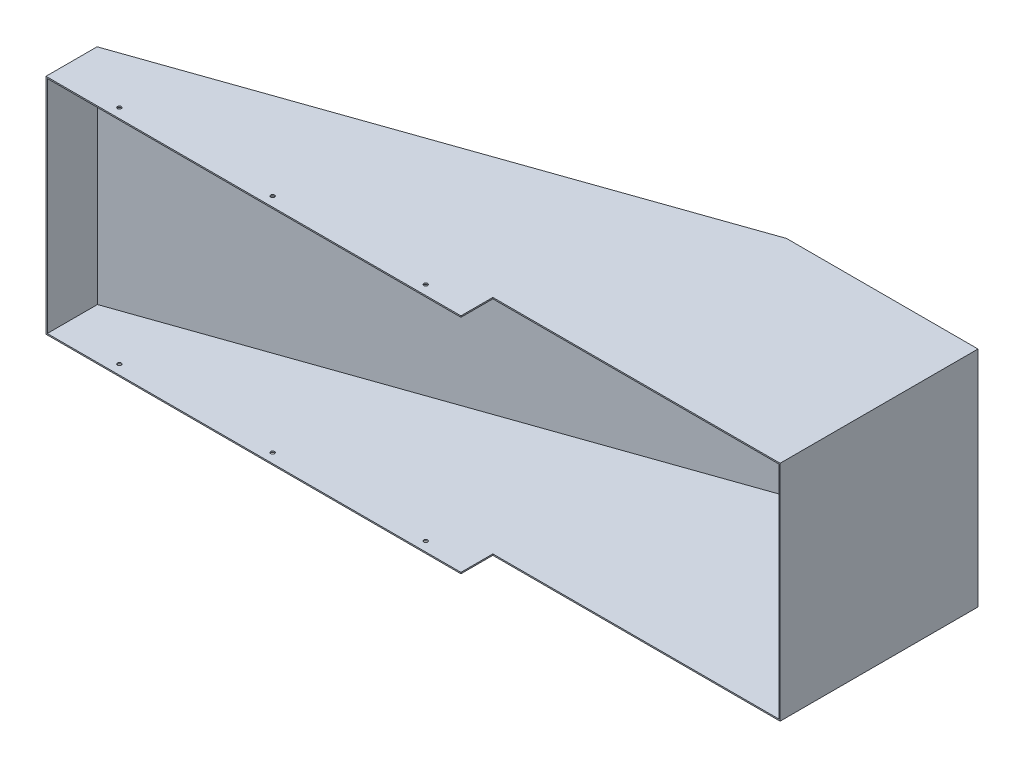
ISO-10303-21;
HEADER;
FILE_DESCRIPTION(('STEP AP214'),'2;1');
FILE_NAME('part.step','',(''),(''),'','','');
FILE_SCHEMA(('AUTOMOTIVE_DESIGN { 1 0 10303 214 1 1 1 1 }'));
ENDSEC;
DATA;
#1=APPLICATION_CONTEXT('core data for automotive mechanical design processes');
#2=APPLICATION_PROTOCOL_DEFINITION('international standard','automotive_design',2000,#1);
#3=PRODUCT_CONTEXT('',#1,'mechanical');
#4=PRODUCT('Part','Part','',(#3));
#5=PRODUCT_RELATED_PRODUCT_CATEGORY('part','',(#4));
#6=PRODUCT_DEFINITION_FORMATION('','',#4);
#7=PRODUCT_DEFINITION_CONTEXT('part definition',#1,'design');
#8=PRODUCT_DEFINITION('design','',#6,#7);
#9=PRODUCT_DEFINITION_SHAPE('','',#8);
#10=(LENGTH_UNIT() NAMED_UNIT(*) SI_UNIT(.MILLI.,.METRE.));
#11=(NAMED_UNIT(*) PLANE_ANGLE_UNIT() SI_UNIT($,.RADIAN.));
#12=(NAMED_UNIT(*) SI_UNIT($,.STERADIAN.) SOLID_ANGLE_UNIT());
#13=UNCERTAINTY_MEASURE_WITH_UNIT(LENGTH_MEASURE(1.E-05),#10,'distance_accuracy_value','');
#14=(GEOMETRIC_REPRESENTATION_CONTEXT(3) GLOBAL_UNCERTAINTY_ASSIGNED_CONTEXT((#13)) GLOBAL_UNIT_ASSIGNED_CONTEXT((#10,
#11,#12)) REPRESENTATION_CONTEXT('',''));
#15=CARTESIAN_POINT('',(0.,0.,0.));
#16=DIRECTION('',(0.,0.,1.));
#17=DIRECTION('',(1.,0.,0.));
#18=AXIS2_PLACEMENT_3D('',#15,#16,#17);
#19=CARTESIAN_POINT('',(250.,175.,310.));
#20=DIRECTION('',(0.,0.,-1.));
#21=DIRECTION('',(-1.,0.,0.));
#22=AXIS2_PLACEMENT_3D('',#19,#20,#21);
#23=PLANE('',#22);
#24=DIRECTION('',(1.,0.,0.));
#25=VECTOR('',#24,1.);
#26=CARTESIAN_POINT('',(250.,-173.,310.));
#27=LINE('',#26,#25);
#28=CARTESIAN_POINT('',(250.,-173.,310.));
#29=VERTEX_POINT('',#28);
#30=CARTESIAN_POINT('',(698.,-173.,310.));
#31=VERTEX_POINT('',#30);
#32=EDGE_CURVE('E173',#29,#31,#27,.T.);
#33=ORIENTED_EDGE('',*,*,#32,.F.);
#34=DIRECTION('',(0.,-1.,0.));
#35=VECTOR('',#34,1.);
#36=CARTESIAN_POINT('',(250.,175.,310.));
#37=LINE('',#36,#35);
#38=CARTESIAN_POINT('',(250.,-175.,310.));
#39=VERTEX_POINT('',#38);
#40=EDGE_CURVE('E259',#29,#39,#37,.T.);
#41=ORIENTED_EDGE('',*,*,#40,.T.);
#42=DIRECTION('',(1.,0.,0.));
#43=VECTOR('',#42,1.);
#44=CARTESIAN_POINT('',(250.,-175.,310.));
#45=LINE('',#44,#43);
#46=CARTESIAN_POINT('',(700.,-175.,310.));
#47=VERTEX_POINT('',#46);
#48=EDGE_CURVE('E245',#39,#47,#45,.T.);
#49=ORIENTED_EDGE('',*,*,#48,.T.);
#50=DIRECTION('',(0.,-1.,0.));
#51=VECTOR('',#50,1.);
#52=CARTESIAN_POINT('',(700.,175.,310.));
#53=LINE('',#52,#51);
#54=CARTESIAN_POINT('',(700.,175.,310.));
#55=VERTEX_POINT('',#54);
#56=EDGE_CURVE('E226',#55,#47,#53,.T.);
#57=ORIENTED_EDGE('',*,*,#56,.F.);
#58=DIRECTION('',(1.,0.,0.));
#59=VECTOR('',#58,1.);
#60=CARTESIAN_POINT('',(250.,175.,310.));
#61=LINE('',#60,#59);
#62=CARTESIAN_POINT('',(250.,175.,310.));
#63=VERTEX_POINT('',#62);
#64=EDGE_CURVE('E244',#63,#55,#61,.T.);
#65=ORIENTED_EDGE('',*,*,#64,.F.);
#66=CARTESIAN_POINT('',(250.,173.,310.));
#67=VERTEX_POINT('',#66);
#68=EDGE_CURVE('E254',#63,#67,#37,.T.);
#69=ORIENTED_EDGE('',*,*,#68,.T.);
#70=DIRECTION('',(1.,0.,0.));
#71=VECTOR('',#70,1.);
#72=CARTESIAN_POINT('',(-400.,173.,310.));
#73=LINE('',#72,#71);
#74=CARTESIAN_POINT('',(698.,173.,310.));
#75=VERTEX_POINT('',#74);
#76=EDGE_CURVE('E56',#67,#75,#73,.T.);
#77=ORIENTED_EDGE('',*,*,#76,.T.);
#78=DIRECTION('',(0.,-1.,0.));
#79=VECTOR('',#78,1.);
#80=CARTESIAN_POINT('',(698.,175.,310.));
#81=LINE('',#80,#79);
#82=EDGE_CURVE('E149',#75,#31,#81,.T.);
#83=ORIENTED_EDGE('',*,*,#82,.T.);
#84=EDGE_LOOP('',(#33,#41,#49,#57,#65,#69,#77,#83));
#85=FACE_BOUND('',#84,.T.);
#86=ADVANCED_FACE('F38',(#85),#23,.F.);
#87=CARTESIAN_POINT('',(250.,175.,360.));
#88=DIRECTION('',(-1.,0.,0.));
#89=DIRECTION('',(0.,0.,1.));
#90=AXIS2_PLACEMENT_3D('',#87,#88,#89);
#91=PLANE('',#90);
#92=DIRECTION('',(0.,0.,-1.));
#93=VECTOR('',#92,1.);
#94=CARTESIAN_POINT('',(250.,-173.,360.));
#95=LINE('',#94,#93);
#96=CARTESIAN_POINT('',(250.,-173.,360.));
#97=VERTEX_POINT('',#96);
#98=EDGE_CURVE('E169',#97,#29,#95,.T.);
#99=ORIENTED_EDGE('',*,*,#98,.F.);
#100=DIRECTION('',(0.,-1.,0.));
#101=VECTOR('',#100,1.);
#102=CARTESIAN_POINT('',(250.,175.,360.));
#103=LINE('',#102,#101);
#104=CARTESIAN_POINT('',(250.,-175.,360.));
#105=VERTEX_POINT('',#104);
#106=EDGE_CURVE('E248',#97,#105,#103,.T.);
#107=ORIENTED_EDGE('',*,*,#106,.T.);
#108=DIRECTION('',(0.,0.,-1.));
#109=VECTOR('',#108,1.);
#110=CARTESIAN_POINT('',(250.,-175.,360.));
#111=LINE('',#110,#109);
#112=EDGE_CURVE('E241',#105,#39,#111,.T.);
#113=ORIENTED_EDGE('',*,*,#112,.T.);
#114=ORIENTED_EDGE('',*,*,#40,.F.);
#115=EDGE_LOOP('',(#99,#107,#113,#114));
#116=FACE_BOUND('',#115,.T.);
#117=ADVANCED_FACE('F347',(#116),#91,.F.);
#118=CARTESIAN_POINT('',(-400.,175.,360.));
#119=DIRECTION('',(0.,-1.,0.));
#120=DIRECTION('',(0.,0.,-1.));
#121=AXIS2_PLACEMENT_3D('',#118,#119,#120);
#122=PLANE('',#121);
#123=CARTESIAN_POINT('',(-300.,175.,345.));
#124=DIRECTION('',(0.,-1.,0.));
#125=DIRECTION('',(0.,0.,-1.));
#126=AXIS2_PLACEMENT_3D('',#123,#124,#125);
#127=CIRCLE('',#126,2.99999999999999);
#128=CARTESIAN_POINT('',(-300.,175.,342.));
#129=VERTEX_POINT('',#128);
#130=EDGE_CURVE('E294',#129,#129,#127,.T.);
#131=ORIENTED_EDGE('',*,*,#130,.T.);
#132=EDGE_LOOP('',(#131));
#133=FACE_BOUND('',#132,.T.);
#134=CARTESIAN_POINT('',(-60.0000000000001,175.,345.));
#135=DIRECTION('',(0.,-1.,0.));
#136=DIRECTION('',(0.,0.,-1.));
#137=AXIS2_PLACEMENT_3D('',#134,#135,#136);
#138=CIRCLE('',#137,3.00000000000001);
#139=CARTESIAN_POINT('',(-60.0000000000001,175.,342.));
#140=VERTEX_POINT('',#139);
#141=EDGE_CURVE('E434',#140,#140,#138,.T.);
#142=ORIENTED_EDGE('',*,*,#141,.T.);
#143=EDGE_LOOP('',(#142));
#144=FACE_BOUND('',#143,.T.);
#145=CARTESIAN_POINT('',(180.,175.,345.));
#146=DIRECTION('',(0.,-1.,0.));
#147=DIRECTION('',(0.,0.,-1.));
#148=AXIS2_PLACEMENT_3D('',#145,#146,#147);
#149=CIRCLE('',#148,2.99999999999999);
#150=CARTESIAN_POINT('',(180.,175.,342.));
#151=VERTEX_POINT('',#150);
#152=EDGE_CURVE('E443',#151,#151,#149,.T.);
#153=ORIENTED_EDGE('',*,*,#152,.T.);
#154=EDGE_LOOP('',(#153));
#155=FACE_BOUND('',#154,.T.);
#156=DIRECTION('',(0.,0.,-1.));
#157=VECTOR('',#156,1.);
#158=CARTESIAN_POINT('',(250.,175.,360.));
#159=LINE('',#158,#157);
#160=CARTESIAN_POINT('',(250.,175.,360.));
#161=VERTEX_POINT('',#160);
#162=EDGE_CURVE('E64',#161,#63,#159,.T.);
#163=ORIENTED_EDGE('',*,*,#162,.T.);
#164=ORIENTED_EDGE('',*,*,#64,.T.);
#165=DIRECTION('',(0.,0.,1.));
#166=VECTOR('',#165,1.);
#167=CARTESIAN_POINT('',(700.,175.,0.));
#168=LINE('',#167,#166);
#169=CARTESIAN_POINT('',(700.,175.,0.));
#170=VERTEX_POINT('',#169);
#171=EDGE_CURVE('E222',#170,#55,#168,.T.);
#172=ORIENTED_EDGE('',*,*,#171,.F.);
#173=DIRECTION('',(-1.,0.,0.));
#174=VECTOR('',#173,1.);
#175=CARTESIAN_POINT('',(700.,175.,0.));
#176=LINE('',#175,#174);
#177=CARTESIAN_POINT('',(400.,175.,0.));
#178=VERTEX_POINT('',#177);
#179=EDGE_CURVE('E237',#170,#178,#176,.T.);
#180=ORIENTED_EDGE('',*,*,#179,.T.);
#181=DIRECTION('',(-0.943858356366017,0.,0.330350424728106));
#182=VECTOR('',#181,1.);
#183=CARTESIAN_POINT('',(-400.,175.,280.));
#184=LINE('',#183,#182);
#185=CARTESIAN_POINT('',(-400.,175.,280.));
#186=VERTEX_POINT('',#185);
#187=EDGE_CURVE('E263',#178,#186,#184,.T.);
#188=ORIENTED_EDGE('',*,*,#187,.T.);
#189=DIRECTION('',(0.,0.,-1.));
#190=VECTOR('',#189,1.);
#191=CARTESIAN_POINT('',(-400.,175.,360.));
#192=LINE('',#191,#190);
#193=CARTESIAN_POINT('',(-400.,175.,360.));
#194=VERTEX_POINT('',#193);
#195=EDGE_CURVE('E11',#194,#186,#192,.T.);
#196=ORIENTED_EDGE('',*,*,#195,.F.);
#197=DIRECTION('',(-1.,0.,0.));
#198=VECTOR('',#197,1.);
#199=CARTESIAN_POINT('',(-400.,175.,360.));
#200=LINE('',#199,#198);
#201=EDGE_CURVE('E274',#161,#194,#200,.T.);
#202=ORIENTED_EDGE('',*,*,#201,.F.);
#203=EDGE_LOOP('',(#163,#164,#172,#180,#188,#196,#202));
#204=FACE_BOUND('',#203,.T.);
#205=ADVANCED_FACE('F40',(#133,#144,#155,#204),#122,.F.);
#206=CARTESIAN_POINT('',(-400.,175.,360.));
#207=DIRECTION('',(1.,0.,0.));
#208=DIRECTION('',(0.,0.,-1.));
#209=AXIS2_PLACEMENT_3D('',#206,#207,#208);
#210=PLANE('',#209);
#211=ORIENTED_EDGE('',*,*,#195,.T.);
#212=DIRECTION('',(0.,-1.,0.));
#213=VECTOR('',#212,1.);
#214=CARTESIAN_POINT('',(-400.,175.,280.));
#215=LINE('',#214,#213);
#216=CARTESIAN_POINT('',(-400.,-175.,280.));
#217=VERTEX_POINT('',#216);
#218=EDGE_CURVE('E267',#186,#217,#215,.T.);
#219=ORIENTED_EDGE('',*,*,#218,.T.);
#220=DIRECTION('',(0.,0.,-1.));
#221=VECTOR('',#220,1.);
#222=CARTESIAN_POINT('',(-400.,-175.,360.));
#223=LINE('',#222,#221);
#224=CARTESIAN_POINT('',(-400.,-175.,360.));
#225=VERTEX_POINT('',#224);
#226=EDGE_CURVE('E48',#225,#217,#223,.T.);
#227=ORIENTED_EDGE('',*,*,#226,.F.);
#228=DIRECTION('',(0.,-1.,0.));
#229=VECTOR('',#228,1.);
#230=CARTESIAN_POINT('',(-400.,175.,360.));
#231=LINE('',#230,#229);
#232=EDGE_CURVE('E277',#194,#225,#231,.T.);
#233=ORIENTED_EDGE('',*,*,#232,.F.);
#234=EDGE_LOOP('',(#211,#219,#227,#233));
#235=FACE_BOUND('',#234,.T.);
#236=ADVANCED_FACE('F362',(#235),#210,.F.);
#237=CARTESIAN_POINT('',(-400.,-175.,360.));
#238=DIRECTION('',(0.,1.,0.));
#239=DIRECTION('',(0.,0.,1.));
#240=AXIS2_PLACEMENT_3D('',#237,#238,#239);
#241=PLANE('',#240);
#242=CARTESIAN_POINT('',(-300.,-175.,345.));
#243=DIRECTION('',(0.,-1.,0.));
#244=DIRECTION('',(0.,0.,-1.));
#245=AXIS2_PLACEMENT_3D('',#242,#243,#244);
#246=CIRCLE('',#245,2.99999999999999);
#247=CARTESIAN_POINT('',(-300.,-175.,342.));
#248=VERTEX_POINT('',#247);
#249=EDGE_CURVE('E430',#248,#248,#246,.T.);
#250=ORIENTED_EDGE('',*,*,#249,.F.);
#251=EDGE_LOOP('',(#250));
#252=FACE_BOUND('',#251,.T.);
#253=CARTESIAN_POINT('',(-60.0000000000001,-175.,345.));
#254=DIRECTION('',(0.,-1.,0.));
#255=DIRECTION('',(0.,0.,-1.));
#256=AXIS2_PLACEMENT_3D('',#253,#254,#255);
#257=CIRCLE('',#256,3.00000000000001);
#258=CARTESIAN_POINT('',(-60.0000000000001,-175.,342.));
#259=VERTEX_POINT('',#258);
#260=EDGE_CURVE('E440',#259,#259,#257,.T.);
#261=ORIENTED_EDGE('',*,*,#260,.F.);
#262=EDGE_LOOP('',(#261));
#263=FACE_BOUND('',#262,.T.);
#264=CARTESIAN_POINT('',(180.,-175.,345.));
#265=DIRECTION('',(0.,-1.,0.));
#266=DIRECTION('',(0.,0.,-1.));
#267=AXIS2_PLACEMENT_3D('',#264,#265,#266);
#268=CIRCLE('',#267,2.99999999999999);
#269=CARTESIAN_POINT('',(180.,-175.,342.));
#270=VERTEX_POINT('',#269);
#271=EDGE_CURVE('E310',#270,#270,#268,.T.);
#272=ORIENTED_EDGE('',*,*,#271,.F.);
#273=EDGE_LOOP('',(#272));
#274=FACE_BOUND('',#273,.T.);
#275=DIRECTION('',(-0.943858356366017,0.,0.330350424728106));
#276=VECTOR('',#275,1.);
#277=CARTESIAN_POINT('',(-400.,-175.,280.));
#278=LINE('',#277,#276);
#279=CARTESIAN_POINT('',(400.,-175.,0.));
#280=VERTEX_POINT('',#279);
#281=EDGE_CURVE('E258',#280,#217,#278,.T.);
#282=ORIENTED_EDGE('',*,*,#281,.F.);
#283=DIRECTION('',(-1.,0.,0.));
#284=VECTOR('',#283,1.);
#285=CARTESIAN_POINT('',(700.,-175.,0.));
#286=LINE('',#285,#284);
#287=CARTESIAN_POINT('',(700.,-175.,0.));
#288=VERTEX_POINT('',#287);
#289=EDGE_CURVE('E233',#288,#280,#286,.T.);
#290=ORIENTED_EDGE('',*,*,#289,.F.);
#291=DIRECTION('',(0.,0.,-1.));
#292=VECTOR('',#291,1.);
#293=CARTESIAN_POINT('',(700.,-175.,310.));
#294=LINE('',#293,#292);
#295=EDGE_CURVE('E230',#47,#288,#294,.T.);
#296=ORIENTED_EDGE('',*,*,#295,.F.);
#297=ORIENTED_EDGE('',*,*,#48,.F.);
#298=ORIENTED_EDGE('',*,*,#112,.F.);
#299=DIRECTION('',(1.,0.,0.));
#300=VECTOR('',#299,1.);
#301=CARTESIAN_POINT('',(-400.,-175.,360.));
#302=LINE('',#301,#300);
#303=EDGE_CURVE('E280',#225,#105,#302,.T.);
#304=ORIENTED_EDGE('',*,*,#303,.F.);
#305=ORIENTED_EDGE('',*,*,#226,.T.);
#306=EDGE_LOOP('',(#282,#290,#296,#297,#298,#304,#305));
#307=FACE_BOUND('',#306,.T.);
#308=ADVANCED_FACE('F366',(#252,#263,#274,#307),#241,.F.);
#309=CARTESIAN_POINT('',(0.,0.,360.));
#310=DIRECTION('',(0.,0.,1.));
#311=DIRECTION('',(1.,0.,0.));
#312=AXIS2_PLACEMENT_3D('',#309,#310,#311);
#313=PLANE('',#312);
#314=DIRECTION('',(-1.,0.,0.));
#315=VECTOR('',#314,1.);
#316=CARTESIAN_POINT('',(-400.,173.,360.));
#317=LINE('',#316,#315);
#318=CARTESIAN_POINT('',(250.,173.,360.));
#319=VERTEX_POINT('',#318);
#320=CARTESIAN_POINT('',(-398.,173.,360.));
#321=VERTEX_POINT('',#320);
#322=EDGE_CURVE('E201',#319,#321,#317,.T.);
#323=ORIENTED_EDGE('',*,*,#322,.F.);
#324=EDGE_CURVE('E260',#161,#319,#103,.T.);
#325=ORIENTED_EDGE('',*,*,#324,.F.);
#326=ORIENTED_EDGE('',*,*,#201,.T.);
#327=ORIENTED_EDGE('',*,*,#232,.T.);
#328=ORIENTED_EDGE('',*,*,#303,.T.);
#329=ORIENTED_EDGE('',*,*,#106,.F.);
#330=DIRECTION('',(1.,0.,0.));
#331=VECTOR('',#330,1.);
#332=CARTESIAN_POINT('',(-400.,-173.,360.));
#333=LINE('',#332,#331);
#334=CARTESIAN_POINT('',(-398.,-173.,360.));
#335=VERTEX_POINT('',#334);
#336=EDGE_CURVE('E195',#335,#97,#333,.T.);
#337=ORIENTED_EDGE('',*,*,#336,.F.);
#338=DIRECTION('',(0.,-1.,0.));
#339=VECTOR('',#338,1.);
#340=CARTESIAN_POINT('',(-398.,175.,360.));
#341=LINE('',#340,#339);
#342=EDGE_CURVE('E208',#321,#335,#341,.T.);
#343=ORIENTED_EDGE('',*,*,#342,.F.);
#344=EDGE_LOOP('',(#323,#325,#326,#327,#328,#329,#337,#343));
#345=FACE_BOUND('',#344,.T.);
#346=ADVANCED_FACE('F341',(#345),#313,.T.);
#347=CARTESIAN_POINT('',(-400.,175.,280.));
#348=DIRECTION('',(0.330350424728106,0.,0.943858356366017));
#349=DIRECTION('',(0.943858356366017,0.,-0.330350424728106));
#350=AXIS2_PLACEMENT_3D('',#347,#348,#349);
#351=PLANE('',#350);
#352=ORIENTED_EDGE('',*,*,#281,.T.);
#353=ORIENTED_EDGE('',*,*,#218,.F.);
#354=ORIENTED_EDGE('',*,*,#187,.F.);
#355=DIRECTION('',(0.,1.,0.));
#356=VECTOR('',#355,1.);
#357=CARTESIAN_POINT('',(400.,175.,0.));
#358=LINE('',#357,#356);
#359=EDGE_CURVE('E273',#280,#178,#358,.T.);
#360=ORIENTED_EDGE('',*,*,#359,.F.);
#361=EDGE_LOOP('',(#352,#353,#354,#360));
#362=FACE_BOUND('',#361,.T.);
#363=ADVANCED_FACE('F376',(#362),#351,.F.);
#364=ORIENTED_EDGE('',*,*,#324,.T.);
#365=DIRECTION('',(0.,0.,-1.));
#366=VECTOR('',#365,1.);
#367=CARTESIAN_POINT('',(250.,173.,360.));
#368=LINE('',#367,#366);
#369=EDGE_CURVE('E203',#319,#67,#368,.T.);
#370=ORIENTED_EDGE('',*,*,#369,.T.);
#371=ORIENTED_EDGE('',*,*,#68,.F.);
#372=ORIENTED_EDGE('',*,*,#162,.F.);
#373=EDGE_LOOP('',(#364,#370,#371,#372));
#374=FACE_BOUND('',#373,.T.);
#375=ADVANCED_FACE('F355',(#374),#91,.F.);
#376=CARTESIAN_POINT('',(700.,-175.,0.));
#377=DIRECTION('',(0.,0.,1.));
#378=DIRECTION('',(1.,0.,0.));
#379=AXIS2_PLACEMENT_3D('',#376,#377,#378);
#380=PLANE('',#379);
#381=ORIENTED_EDGE('',*,*,#359,.T.);
#382=ORIENTED_EDGE('',*,*,#179,.F.);
#383=DIRECTION('',(0.,1.,0.));
#384=VECTOR('',#383,1.);
#385=CARTESIAN_POINT('',(700.,-175.,0.));
#386=LINE('',#385,#384);
#387=EDGE_CURVE('E186',#288,#170,#386,.T.);
#388=ORIENTED_EDGE('',*,*,#387,.F.);
#389=ORIENTED_EDGE('',*,*,#289,.T.);
#390=EDGE_LOOP('',(#381,#382,#388,#389));
#391=FACE_BOUND('',#390,.T.);
#392=ADVANCED_FACE('F374',(#391),#380,.F.);
#393=CARTESIAN_POINT('',(700.,1.11022302462516E-13,0.));
#394=DIRECTION('',(1.,0.,0.));
#395=DIRECTION('',(0.,1.,0.));
#396=AXIS2_PLACEMENT_3D('',#393,#394,#395);
#397=PLANE('',#396);
#398=ORIENTED_EDGE('',*,*,#387,.T.);
#399=ORIENTED_EDGE('',*,*,#171,.T.);
#400=ORIENTED_EDGE('',*,*,#56,.T.);
#401=ORIENTED_EDGE('',*,*,#295,.T.);
#402=EDGE_LOOP('',(#398,#399,#400,#401));
#403=FACE_BOUND('',#402,.T.);
#404=ADVANCED_FACE('F371',(#403),#397,.T.);
#405=CARTESIAN_POINT('',(-400.,173.,360.));
#406=DIRECTION('',(0.,-1.,0.));
#407=DIRECTION('',(0.,0.,-1.));
#408=AXIS2_PLACEMENT_3D('',#405,#406,#407);
#409=PLANE('',#408);
#410=CARTESIAN_POINT('',(-300.,173.,345.));
#411=DIRECTION('',(0.,-1.,0.));
#412=DIRECTION('',(0.,0.,-1.));
#413=AXIS2_PLACEMENT_3D('',#410,#411,#412);
#414=CIRCLE('',#413,2.99999999999999);
#415=CARTESIAN_POINT('',(-300.,173.,342.));
#416=VERTEX_POINT('',#415);
#417=EDGE_CURVE('E162',#416,#416,#414,.T.);
#418=ORIENTED_EDGE('',*,*,#417,.F.);
#419=EDGE_LOOP('',(#418));
#420=FACE_BOUND('',#419,.T.);
#421=CARTESIAN_POINT('',(-60.0000000000001,173.,345.));
#422=DIRECTION('',(0.,-1.,0.));
#423=DIRECTION('',(0.,0.,-1.));
#424=AXIS2_PLACEMENT_3D('',#421,#422,#423);
#425=CIRCLE('',#424,3.00000000000001);
#426=CARTESIAN_POINT('',(-60.0000000000001,173.,342.));
#427=VERTEX_POINT('',#426);
#428=EDGE_CURVE('E298',#427,#427,#425,.T.);
#429=ORIENTED_EDGE('',*,*,#428,.F.);
#430=EDGE_LOOP('',(#429));
#431=FACE_BOUND('',#430,.T.);
#432=CARTESIAN_POINT('',(180.,173.,345.));
#433=DIRECTION('',(0.,-1.,0.));
#434=DIRECTION('',(0.,0.,-1.));
#435=AXIS2_PLACEMENT_3D('',#432,#433,#434);
#436=CIRCLE('',#435,2.99999999999999);
#437=CARTESIAN_POINT('',(180.,173.,342.));
#438=VERTEX_POINT('',#437);
#439=EDGE_CURVE('E293',#438,#438,#436,.T.);
#440=ORIENTED_EDGE('',*,*,#439,.F.);
#441=EDGE_LOOP('',(#440));
#442=FACE_BOUND('',#441,.T.);
#443=ORIENTED_EDGE('',*,*,#369,.F.);
#444=ORIENTED_EDGE('',*,*,#322,.T.);
#445=DIRECTION('',(0.,0.,-1.));
#446=VECTOR('',#445,1.);
#447=CARTESIAN_POINT('',(-398.,173.,360.));
#448=LINE('',#447,#446);
#449=CARTESIAN_POINT('',(-398.,173.,281.418962010042));
#450=VERTEX_POINT('',#449);
#451=EDGE_CURVE('E183',#321,#450,#448,.T.);
#452=ORIENTED_EDGE('',*,*,#451,.T.);
#453=DIRECTION('',(-0.943858356366018,0.,0.330350424728106));
#454=VECTOR('',#453,1.);
#455=CARTESIAN_POINT('',(-424.283619863239,173.,290.618228962175));
#456=LINE('',#455,#454);
#457=CARTESIAN_POINT('',(400.339891457262,173.,2.));
#458=VERTEX_POINT('',#457);
#459=EDGE_CURVE('E167',#458,#450,#456,.T.);
#460=ORIENTED_EDGE('',*,*,#459,.F.);
#461=DIRECTION('',(-1.,0.,0.));
#462=VECTOR('',#461,1.);
#463=CARTESIAN_POINT('',(-400.,173.,2.));
#464=LINE('',#463,#462);
#465=CARTESIAN_POINT('',(698.,173.,2.));
#466=VERTEX_POINT('',#465);
#467=EDGE_CURVE('E157',#466,#458,#464,.T.);
#468=ORIENTED_EDGE('',*,*,#467,.F.);
#469=DIRECTION('',(0.,0.,1.));
#470=VECTOR('',#469,1.);
#471=CARTESIAN_POINT('',(698.,173.,360.));
#472=LINE('',#471,#470);
#473=EDGE_CURVE('E143',#466,#75,#472,.T.);
#474=ORIENTED_EDGE('',*,*,#473,.T.);
#475=ORIENTED_EDGE('',*,*,#76,.F.);
#476=EDGE_LOOP('',(#443,#444,#452,#460,#468,#474,#475));
#477=FACE_BOUND('',#476,.T.);
#478=ADVANCED_FACE('F164',(#420,#431,#442,#477),#409,.T.);
#479=CARTESIAN_POINT('',(-398.,175.,360.));
#480=DIRECTION('',(1.,0.,0.));
#481=DIRECTION('',(0.,0.,-1.));
#482=AXIS2_PLACEMENT_3D('',#479,#480,#481);
#483=PLANE('',#482);
#484=ORIENTED_EDGE('',*,*,#451,.F.);
#485=ORIENTED_EDGE('',*,*,#342,.T.);
#486=DIRECTION('',(0.,0.,-1.));
#487=VECTOR('',#486,1.);
#488=CARTESIAN_POINT('',(-398.,-173.,360.));
#489=LINE('',#488,#487);
#490=CARTESIAN_POINT('',(-398.,-173.,281.418962010042));
#491=VERTEX_POINT('',#490);
#492=EDGE_CURVE('E187',#335,#491,#489,.T.);
#493=ORIENTED_EDGE('',*,*,#492,.T.);
#494=DIRECTION('',(0.,-1.,0.));
#495=VECTOR('',#494,1.);
#496=CARTESIAN_POINT('',(-398.,175.,281.418962010042));
#497=LINE('',#496,#495);
#498=EDGE_CURVE('E181',#450,#491,#497,.T.);
#499=ORIENTED_EDGE('',*,*,#498,.F.);
#500=EDGE_LOOP('',(#484,#485,#493,#499));
#501=FACE_BOUND('',#500,.T.);
#502=ADVANCED_FACE('F327',(#501),#483,.T.);
#503=CARTESIAN_POINT('',(-400.,-173.,360.));
#504=DIRECTION('',(0.,1.,0.));
#505=DIRECTION('',(0.,0.,1.));
#506=AXIS2_PLACEMENT_3D('',#503,#504,#505);
#507=PLANE('',#506);
#508=CARTESIAN_POINT('',(-300.,-173.,345.));
#509=DIRECTION('',(0.,1.,0.));
#510=DIRECTION('',(0.,0.,1.));
#511=AXIS2_PLACEMENT_3D('',#508,#509,#510);
#512=CIRCLE('',#511,2.99999999999999);
#513=CARTESIAN_POINT('',(-300.,-173.,348.));
#514=VERTEX_POINT('',#513);
#515=EDGE_CURVE('E42',#514,#514,#512,.T.);
#516=ORIENTED_EDGE('',*,*,#515,.F.);
#517=EDGE_LOOP('',(#516));
#518=FACE_BOUND('',#517,.T.);
#519=CARTESIAN_POINT('',(-60.0000000000001,-173.,345.));
#520=DIRECTION('',(0.,1.,0.));
#521=DIRECTION('',(0.,0.,1.));
#522=AXIS2_PLACEMENT_3D('',#519,#520,#521);
#523=CIRCLE('',#522,3.00000000000001);
#524=CARTESIAN_POINT('',(-60.0000000000001,-173.,348.));
#525=VERTEX_POINT('',#524);
#526=EDGE_CURVE('E295',#525,#525,#523,.T.);
#527=ORIENTED_EDGE('',*,*,#526,.F.);
#528=EDGE_LOOP('',(#527));
#529=FACE_BOUND('',#528,.T.);
#530=CARTESIAN_POINT('',(180.,-173.,345.));
#531=DIRECTION('',(0.,1.,0.));
#532=DIRECTION('',(0.,0.,1.));
#533=AXIS2_PLACEMENT_3D('',#530,#531,#532);
#534=CIRCLE('',#533,2.99999999999999);
#535=CARTESIAN_POINT('',(180.,-173.,348.));
#536=VERTEX_POINT('',#535);
#537=EDGE_CURVE('E290',#536,#536,#534,.T.);
#538=ORIENTED_EDGE('',*,*,#537,.F.);
#539=EDGE_LOOP('',(#538));
#540=FACE_BOUND('',#539,.T.);
#541=DIRECTION('',(-0.943858356366018,0.,0.330350424728106));
#542=VECTOR('',#541,1.);
#543=CARTESIAN_POINT('',(-399.339299150544,-173.,281.887716712732));
#544=LINE('',#543,#542);
#545=CARTESIAN_POINT('',(400.339891457262,-173.,2.));
#546=VERTEX_POINT('',#545);
#547=EDGE_CURVE('E182',#546,#491,#544,.T.);
#548=ORIENTED_EDGE('',*,*,#547,.T.);
#549=ORIENTED_EDGE('',*,*,#492,.F.);
#550=ORIENTED_EDGE('',*,*,#336,.T.);
#551=ORIENTED_EDGE('',*,*,#98,.T.);
#552=ORIENTED_EDGE('',*,*,#32,.T.);
#553=DIRECTION('',(0.,0.,-1.));
#554=VECTOR('',#553,1.);
#555=CARTESIAN_POINT('',(698.,-173.,360.));
#556=LINE('',#555,#554);
#557=CARTESIAN_POINT('',(698.,-173.,2.));
#558=VERTEX_POINT('',#557);
#559=EDGE_CURVE('E175',#31,#558,#556,.T.);
#560=ORIENTED_EDGE('',*,*,#559,.T.);
#561=DIRECTION('',(-1.,0.,0.));
#562=VECTOR('',#561,1.);
#563=CARTESIAN_POINT('',(700.,-173.,2.));
#564=LINE('',#563,#562);
#565=EDGE_CURVE('E160',#558,#546,#564,.T.);
#566=ORIENTED_EDGE('',*,*,#565,.T.);
#567=EDGE_LOOP('',(#548,#549,#550,#551,#552,#560,#566));
#568=FACE_BOUND('',#567,.T.);
#569=ADVANCED_FACE('F323',(#518,#529,#540,#568),#507,.T.);
#570=CARTESIAN_POINT('',(-399.339299150544,175.,281.887716712732));
#571=DIRECTION('',(0.330350424728106,0.,0.943858356366017));
#572=DIRECTION('',(0.943858356366017,0.,-0.330350424728106));
#573=AXIS2_PLACEMENT_3D('',#570,#571,#572);
#574=PLANE('',#573);
#575=ORIENTED_EDGE('',*,*,#547,.F.);
#576=DIRECTION('',(0.,1.,0.));
#577=VECTOR('',#576,1.);
#578=CARTESIAN_POINT('',(400.339891457262,-175.,2.));
#579=LINE('',#578,#577);
#580=EDGE_CURVE('E191',#546,#458,#579,.T.);
#581=ORIENTED_EDGE('',*,*,#580,.T.);
#582=ORIENTED_EDGE('',*,*,#459,.T.);
#583=ORIENTED_EDGE('',*,*,#498,.T.);
#584=EDGE_LOOP('',(#575,#581,#582,#583));
#585=FACE_BOUND('',#584,.T.);
#586=ADVANCED_FACE('F326',(#585),#574,.T.);
#587=CARTESIAN_POINT('',(700.,-175.,2.));
#588=DIRECTION('',(0.,0.,1.));
#589=DIRECTION('',(1.,0.,0.));
#590=AXIS2_PLACEMENT_3D('',#587,#588,#589);
#591=PLANE('',#590);
#592=ORIENTED_EDGE('',*,*,#580,.F.);
#593=ORIENTED_EDGE('',*,*,#565,.F.);
#594=DIRECTION('',(0.,1.,0.));
#595=VECTOR('',#594,1.);
#596=CARTESIAN_POINT('',(698.,-175.,2.));
#597=LINE('',#596,#595);
#598=EDGE_CURVE('E147',#558,#466,#597,.T.);
#599=ORIENTED_EDGE('',*,*,#598,.T.);
#600=ORIENTED_EDGE('',*,*,#467,.T.);
#601=EDGE_LOOP('',(#592,#593,#599,#600));
#602=FACE_BOUND('',#601,.T.);
#603=ADVANCED_FACE('F156',(#602),#591,.T.);
#604=CARTESIAN_POINT('',(698.,1.10705095884051E-13,0.));
#605=DIRECTION('',(1.,0.,0.));
#606=DIRECTION('',(0.,1.,0.));
#607=AXIS2_PLACEMENT_3D('',#604,#605,#606);
#608=PLANE('',#607);
#609=ORIENTED_EDGE('',*,*,#598,.F.);
#610=ORIENTED_EDGE('',*,*,#559,.F.);
#611=ORIENTED_EDGE('',*,*,#82,.F.);
#612=ORIENTED_EDGE('',*,*,#473,.F.);
#613=EDGE_LOOP('',(#609,#610,#611,#612));
#614=FACE_BOUND('',#613,.T.);
#615=ADVANCED_FACE('F145',(#614),#608,.F.);
#616=CARTESIAN_POINT('',(180.,175.,345.));
#617=DIRECTION('',(0.,-1.,0.));
#618=DIRECTION('',(0.,0.,-1.));
#619=AXIS2_PLACEMENT_3D('',#616,#617,#618);
#620=CYLINDRICAL_SURFACE('',#619,2.99999999999999);
#621=ORIENTED_EDGE('',*,*,#537,.T.);
#622=EDGE_LOOP('',(#621));
#623=FACE_BOUND('',#622,.T.);
#624=ORIENTED_EDGE('',*,*,#271,.T.);
#625=EDGE_LOOP('',(#624));
#626=FACE_BOUND('',#625,.T.);
#627=ADVANCED_FACE('F397',(#623,#626),#620,.F.);
#628=CARTESIAN_POINT('',(-60.0000000000001,175.,345.));
#629=DIRECTION('',(0.,-1.,0.));
#630=DIRECTION('',(0.,0.,-1.));
#631=AXIS2_PLACEMENT_3D('',#628,#629,#630);
#632=CYLINDRICAL_SURFACE('',#631,3.00000000000001);
#633=ORIENTED_EDGE('',*,*,#526,.T.);
#634=EDGE_LOOP('',(#633));
#635=FACE_BOUND('',#634,.T.);
#636=ORIENTED_EDGE('',*,*,#260,.T.);
#637=EDGE_LOOP('',(#636));
#638=FACE_BOUND('',#637,.T.);
#639=ADVANCED_FACE('F409',(#635,#638),#632,.F.);
#640=CARTESIAN_POINT('',(-300.,175.,345.));
#641=DIRECTION('',(0.,-1.,0.));
#642=DIRECTION('',(0.,0.,-1.));
#643=AXIS2_PLACEMENT_3D('',#640,#641,#642);
#644=CYLINDRICAL_SURFACE('',#643,2.99999999999999);
#645=ORIENTED_EDGE('',*,*,#515,.T.);
#646=EDGE_LOOP('',(#645));
#647=FACE_BOUND('',#646,.T.);
#648=ORIENTED_EDGE('',*,*,#249,.T.);
#649=EDGE_LOOP('',(#648));
#650=FACE_BOUND('',#649,.T.);
#651=ADVANCED_FACE('F320',(#647,#650),#644,.F.);
#652=ORIENTED_EDGE('',*,*,#439,.T.);
#653=EDGE_LOOP('',(#652));
#654=FACE_BOUND('',#653,.T.);
#655=ORIENTED_EDGE('',*,*,#152,.F.);
#656=EDGE_LOOP('',(#655));
#657=FACE_BOUND('',#656,.T.);
#658=ADVANCED_FACE('F411',(#654,#657),#620,.F.);
#659=ORIENTED_EDGE('',*,*,#428,.T.);
#660=EDGE_LOOP('',(#659));
#661=FACE_BOUND('',#660,.T.);
#662=ORIENTED_EDGE('',*,*,#141,.F.);
#663=EDGE_LOOP('',(#662));
#664=FACE_BOUND('',#663,.T.);
#665=ADVANCED_FACE('F414',(#661,#664),#632,.F.);
#666=ORIENTED_EDGE('',*,*,#417,.T.);
#667=EDGE_LOOP('',(#666));
#668=FACE_BOUND('',#667,.T.);
#669=ORIENTED_EDGE('',*,*,#130,.F.);
#670=EDGE_LOOP('',(#669));
#671=FACE_BOUND('',#670,.T.);
#672=ADVANCED_FACE('F416',(#668,#671),#644,.F.);
#673=CLOSED_SHELL('',(#86,#117,#205,#236,#308,#346,#363,#375,#392,#404,#478,#502,#569,#586,#603,
#615,#627,#639,#651,#658,#665,#672));
#674=MANIFOLD_SOLID_BREP('B2',#673);
#675=ADVANCED_BREP_SHAPE_REPRESENTATION('',(#18,#674),#14);
#676=SHAPE_DEFINITION_REPRESENTATION(#9,#675);
ENDSEC;
END-ISO-10303-21;
